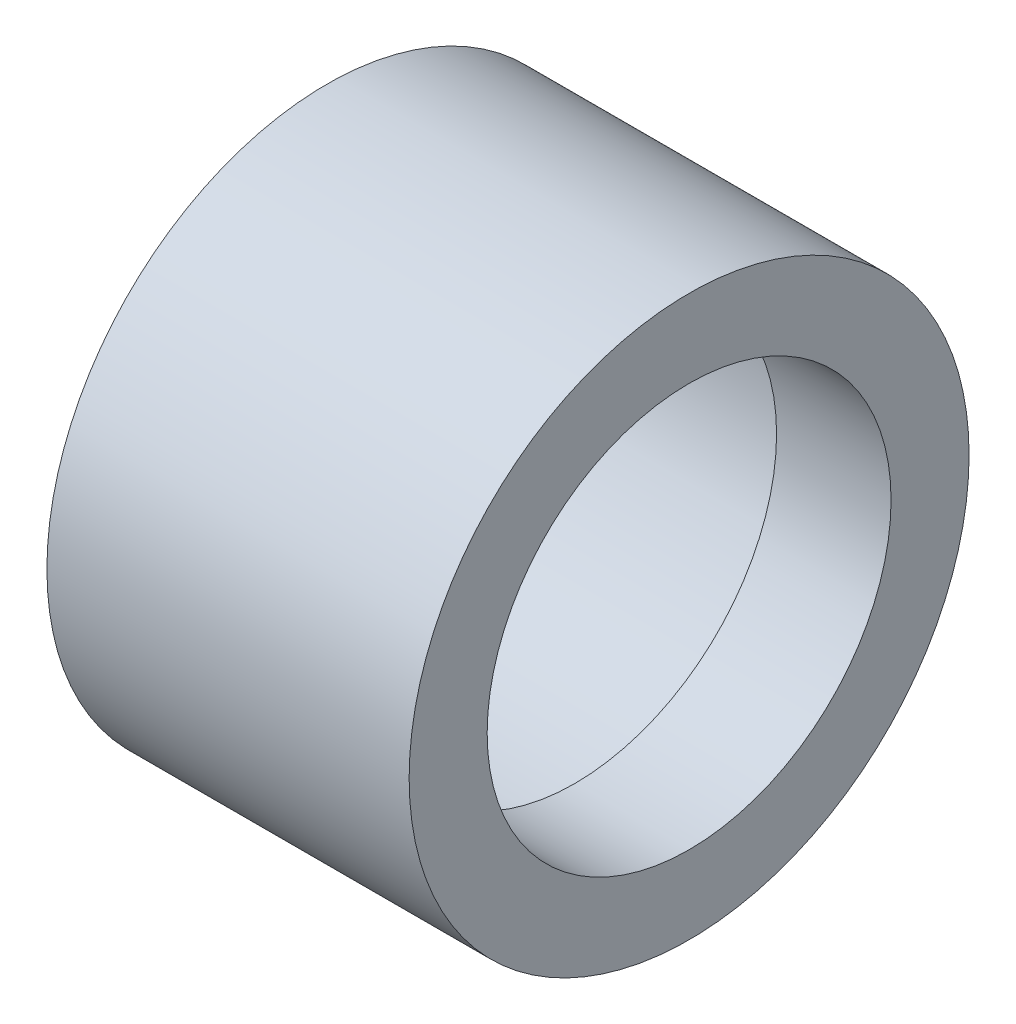
ISO-10303-21;
HEADER;
FILE_DESCRIPTION(('STEP AP214'),'2;1');
FILE_NAME('part.step','',(''),(''),'','','');
FILE_SCHEMA(('AUTOMOTIVE_DESIGN { 1 0 10303 214 1 1 1 1 }'));
ENDSEC;
DATA;
#1=APPLICATION_CONTEXT('core data for automotive mechanical design processes');
#2=APPLICATION_PROTOCOL_DEFINITION('international standard','automotive_design',2000,#1);
#3=PRODUCT_CONTEXT('',#1,'mechanical');
#4=PRODUCT('Part','Part','',(#3));
#5=PRODUCT_RELATED_PRODUCT_CATEGORY('part','',(#4));
#6=PRODUCT_DEFINITION_FORMATION('','',#4);
#7=PRODUCT_DEFINITION_CONTEXT('part definition',#1,'design');
#8=PRODUCT_DEFINITION('design','',#6,#7);
#9=PRODUCT_DEFINITION_SHAPE('','',#8);
#10=(LENGTH_UNIT() NAMED_UNIT(*) SI_UNIT(.MILLI.,.METRE.));
#11=(NAMED_UNIT(*) PLANE_ANGLE_UNIT() SI_UNIT($,.RADIAN.));
#12=(NAMED_UNIT(*) SI_UNIT($,.STERADIAN.) SOLID_ANGLE_UNIT());
#13=UNCERTAINTY_MEASURE_WITH_UNIT(LENGTH_MEASURE(1.E-05),#10,'distance_accuracy_value','');
#14=(GEOMETRIC_REPRESENTATION_CONTEXT(3) GLOBAL_UNCERTAINTY_ASSIGNED_CONTEXT((#13)) GLOBAL_UNIT_ASSIGNED_CONTEXT((#10,
#11,#12)) REPRESENTATION_CONTEXT('',''));
#15=CARTESIAN_POINT('',(0.,0.,0.));
#16=DIRECTION('',(0.,0.,1.));
#17=DIRECTION('',(1.,0.,0.));
#18=AXIS2_PLACEMENT_3D('',#15,#16,#17);
#19=CARTESIAN_POINT('',(39.4589,0.,0.));
#20=DIRECTION('',(-1.,0.,0.));
#21=DIRECTION('',(0.,0.,1.));
#22=AXIS2_PLACEMENT_3D('',#19,#20,#21);
#23=CYLINDRICAL_SURFACE('',#22,22.);
#24=CARTESIAN_POINT('',(39.4589,0.,0.));
#25=DIRECTION('',(-1.,0.,0.));
#26=DIRECTION('',(0.,0.,1.));
#27=AXIS2_PLACEMENT_3D('',#24,#25,#26);
#28=CIRCLE('',#27,22.);
#29=CARTESIAN_POINT('',(39.4589,0.,22.));
#30=VERTEX_POINT('',#29);
#31=EDGE_CURVE('E49',#30,#30,#28,.T.);
#32=ORIENTED_EDGE('',*,*,#31,.F.);
#33=EDGE_LOOP('',(#32));
#34=FACE_BOUND('',#33,.T.);
#35=CARTESIAN_POINT('',(26.9875,0.,0.));
#36=DIRECTION('',(-1.,0.,0.));
#37=DIRECTION('',(0.,0.,1.));
#38=AXIS2_PLACEMENT_3D('',#35,#36,#37);
#39=CIRCLE('',#38,22.);
#40=CARTESIAN_POINT('',(26.9875,0.,22.));
#41=VERTEX_POINT('',#40);
#42=EDGE_CURVE('E40',#41,#41,#39,.F.);
#43=ORIENTED_EDGE('',*,*,#42,.F.);
#44=EDGE_LOOP('',(#43));
#45=FACE_BOUND('',#44,.T.);
#46=ADVANCED_FACE('F36',(#34,#45),#23,.F.);
#47=CARTESIAN_POINT('',(39.4589,0.,0.));
#48=DIRECTION('',(-1.,0.,0.));
#49=DIRECTION('',(0.,0.,1.));
#50=AXIS2_PLACEMENT_3D('',#47,#48,#49);
#51=CYLINDRICAL_SURFACE('',#50,30.5);
#52=CARTESIAN_POINT('',(39.4589,0.,0.));
#53=DIRECTION('',(1.,0.,0.));
#54=DIRECTION('',(0.,0.,-1.));
#55=AXIS2_PLACEMENT_3D('',#52,#53,#54);
#56=CIRCLE('',#55,30.5);
#57=CARTESIAN_POINT('',(39.4589,0.,-30.5));
#58=VERTEX_POINT('',#57);
#59=EDGE_CURVE('E10',#58,#58,#56,.T.);
#60=ORIENTED_EDGE('',*,*,#59,.F.);
#61=EDGE_LOOP('',(#60));
#62=FACE_BOUND('',#61,.T.);
#63=CARTESIAN_POINT('',(0.,0.,0.));
#64=DIRECTION('',(1.,0.,0.));
#65=DIRECTION('',(0.,0.,-1.));
#66=AXIS2_PLACEMENT_3D('',#63,#64,#65);
#67=CIRCLE('',#66,30.5);
#68=CARTESIAN_POINT('',(0.,0.,-30.5));
#69=VERTEX_POINT('',#68);
#70=EDGE_CURVE('E44',#69,#69,#67,.T.);
#71=ORIENTED_EDGE('',*,*,#70,.T.);
#72=EDGE_LOOP('',(#71));
#73=FACE_BOUND('',#72,.T.);
#74=ADVANCED_FACE('F38',(#62,#73),#51,.T.);
#75=CARTESIAN_POINT('',(39.4589,0.,0.));
#76=DIRECTION('',(1.,0.,0.));
#77=DIRECTION('',(0.,0.,-1.));
#78=AXIS2_PLACEMENT_3D('',#75,#76,#77);
#79=PLANE('',#78);
#80=ORIENTED_EDGE('',*,*,#31,.T.);
#81=EDGE_LOOP('',(#80));
#82=FACE_BOUND('',#81,.T.);
#83=ORIENTED_EDGE('',*,*,#59,.T.);
#84=EDGE_LOOP('',(#83));
#85=FACE_BOUND('',#84,.T.);
#86=ADVANCED_FACE('F71',(#82,#85),#79,.T.);
#87=CARTESIAN_POINT('',(0.,0.,0.));
#88=DIRECTION('',(1.,0.,0.));
#89=DIRECTION('',(0.,0.,-1.));
#90=AXIS2_PLACEMENT_3D('',#87,#88,#89);
#91=PLANE('',#90);
#92=CARTESIAN_POINT('',(0.,0.,0.));
#93=DIRECTION('',(-1.,0.,0.));
#94=DIRECTION('',(0.,0.,1.));
#95=AXIS2_PLACEMENT_3D('',#92,#93,#94);
#96=CIRCLE('',#95,26.9875);
#97=CARTESIAN_POINT('',(0.,0.,26.9875));
#98=VERTEX_POINT('',#97);
#99=EDGE_CURVE('E53',#98,#98,#96,.T.);
#100=ORIENTED_EDGE('',*,*,#99,.F.);
#101=EDGE_LOOP('',(#100));
#102=FACE_BOUND('',#101,.T.);
#103=ORIENTED_EDGE('',*,*,#70,.F.);
#104=EDGE_LOOP('',(#103));
#105=FACE_BOUND('',#104,.T.);
#106=ADVANCED_FACE('F79',(#102,#105),#91,.F.);
#107=CARTESIAN_POINT('',(26.9875,0.,0.));
#108=DIRECTION('',(-1.,0.,0.));
#109=DIRECTION('',(0.,0.,1.));
#110=AXIS2_PLACEMENT_3D('',#107,#108,#109);
#111=PLANE('',#110);
#112=CARTESIAN_POINT('',(26.9875,0.,0.));
#113=DIRECTION('',(-1.,0.,0.));
#114=DIRECTION('',(0.,0.,1.));
#115=AXIS2_PLACEMENT_3D('',#112,#113,#114);
#116=CIRCLE('',#115,26.9875);
#117=CARTESIAN_POINT('',(26.9875,0.,26.9875));
#118=VERTEX_POINT('',#117);
#119=EDGE_CURVE('E56',#118,#118,#116,.T.);
#120=ORIENTED_EDGE('',*,*,#119,.T.);
#121=EDGE_LOOP('',(#120));
#122=FACE_BOUND('',#121,.T.);
#123=ORIENTED_EDGE('',*,*,#42,.T.);
#124=EDGE_LOOP('',(#123));
#125=FACE_BOUND('',#124,.T.);
#126=ADVANCED_FACE('F63',(#122,#125),#111,.T.);
#127=CARTESIAN_POINT('',(26.9875,0.,0.));
#128=DIRECTION('',(-1.,0.,0.));
#129=DIRECTION('',(0.,0.,1.));
#130=AXIS2_PLACEMENT_3D('',#127,#128,#129);
#131=CYLINDRICAL_SURFACE('',#130,26.9875);
#132=ORIENTED_EDGE('',*,*,#119,.F.);
#133=EDGE_LOOP('',(#132));
#134=FACE_BOUND('',#133,.T.);
#135=ORIENTED_EDGE('',*,*,#99,.T.);
#136=EDGE_LOOP('',(#135));
#137=FACE_BOUND('',#136,.T.);
#138=ADVANCED_FACE('F76',(#134,#137),#131,.F.);
#139=CLOSED_SHELL('',(#46,#74,#86,#106,#126,#138));
#140=MANIFOLD_SOLID_BREP('B2',#139);
#141=ADVANCED_BREP_SHAPE_REPRESENTATION('',(#18,#140),#14);
#142=SHAPE_DEFINITION_REPRESENTATION(#9,#141);
ENDSEC;
END-ISO-10303-21;
